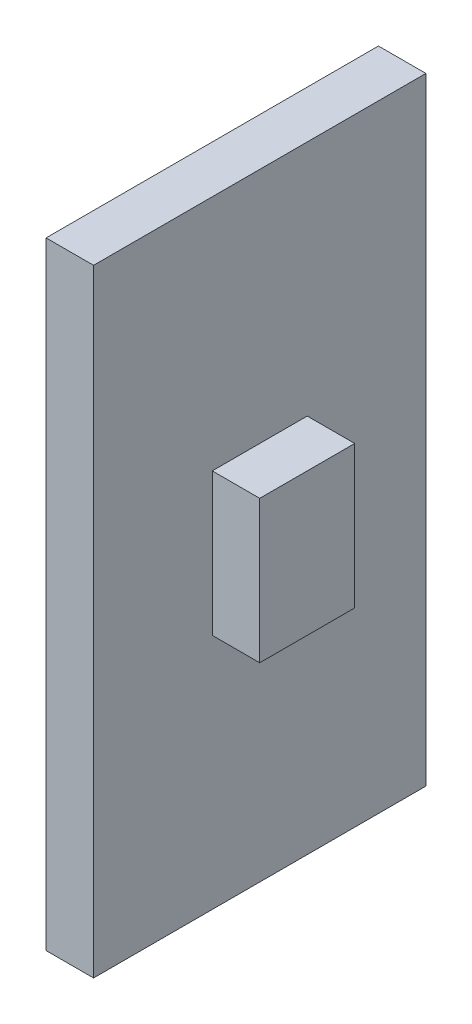
ISO-10303-21;
HEADER;
FILE_DESCRIPTION(('STEP AP214'),'2;1');
FILE_NAME('part.step','',(''),(''),'','','');
FILE_SCHEMA(('AUTOMOTIVE_DESIGN { 1 0 10303 214 1 1 1 1 }'));
ENDSEC;
DATA;
#1=APPLICATION_CONTEXT('core data for automotive mechanical design processes');
#2=APPLICATION_PROTOCOL_DEFINITION('international standard','automotive_design',2000,#1);
#3=PRODUCT_CONTEXT('',#1,'mechanical');
#4=PRODUCT('Part','Part','',(#3));
#5=PRODUCT_RELATED_PRODUCT_CATEGORY('part','',(#4));
#6=PRODUCT_DEFINITION_FORMATION('','',#4);
#7=PRODUCT_DEFINITION_CONTEXT('part definition',#1,'design');
#8=PRODUCT_DEFINITION('design','',#6,#7);
#9=PRODUCT_DEFINITION_SHAPE('','',#8);
#10=(LENGTH_UNIT() NAMED_UNIT(*) SI_UNIT(.MILLI.,.METRE.));
#11=(NAMED_UNIT(*) PLANE_ANGLE_UNIT() SI_UNIT($,.RADIAN.));
#12=(NAMED_UNIT(*) SI_UNIT($,.STERADIAN.) SOLID_ANGLE_UNIT());
#13=UNCERTAINTY_MEASURE_WITH_UNIT(LENGTH_MEASURE(1.E-05),#10,'distance_accuracy_value','');
#14=(GEOMETRIC_REPRESENTATION_CONTEXT(3) GLOBAL_UNCERTAINTY_ASSIGNED_CONTEXT((#13)) GLOBAL_UNIT_ASSIGNED_CONTEXT((#10,
#11,#12)) REPRESENTATION_CONTEXT('',''));
#15=CARTESIAN_POINT('',(0.,0.,0.));
#16=DIRECTION('',(0.,0.,1.));
#17=DIRECTION('',(1.,0.,0.));
#18=AXIS2_PLACEMENT_3D('',#15,#16,#17);
#19=CARTESIAN_POINT('',(2.,0.366666666666666,-1.));
#20=DIRECTION('',(0.,0.,1.));
#21=DIRECTION('',(0.,-1.,0.));
#22=AXIS2_PLACEMENT_3D('',#19,#20,#21);
#23=PLANE('',#22);
#24=DIRECTION('',(0.,1.,0.));
#25=VECTOR('',#24,1.);
#26=CARTESIAN_POINT('',(1.,0.366666666666666,-1.));
#27=LINE('',#26,#25);
#28=CARTESIAN_POINT('',(1.,-2.63333333333333,-1.));
#29=VERTEX_POINT('',#28);
#30=CARTESIAN_POINT('',(1.,0.366666666666666,-1.));
#31=VERTEX_POINT('',#30);
#32=EDGE_CURVE('E114',#29,#31,#27,.T.);
#33=ORIENTED_EDGE('',*,*,#32,.T.);
#34=DIRECTION('',(-1.,0.,0.));
#35=VECTOR('',#34,1.);
#36=CARTESIAN_POINT('',(2.,0.366666666666666,-1.));
#37=LINE('',#36,#35);
#38=CARTESIAN_POINT('',(2.,0.366666666666666,-1.));
#39=VERTEX_POINT('',#38);
#40=EDGE_CURVE('E12',#39,#31,#37,.T.);
#41=ORIENTED_EDGE('',*,*,#40,.F.);
#42=DIRECTION('',(0.,1.,0.));
#43=VECTOR('',#42,1.);
#44=CARTESIAN_POINT('',(2.,0.366666666666666,-1.));
#45=LINE('',#44,#43);
#46=CARTESIAN_POINT('',(2.,-2.63333333333333,-1.));
#47=VERTEX_POINT('',#46);
#48=EDGE_CURVE('E102',#47,#39,#45,.T.);
#49=ORIENTED_EDGE('',*,*,#48,.F.);
#50=DIRECTION('',(-1.,0.,0.));
#51=VECTOR('',#50,1.);
#52=CARTESIAN_POINT('',(2.,-2.63333333333333,-1.));
#53=LINE('',#52,#51);
#54=EDGE_CURVE('E110',#47,#29,#53,.T.);
#55=ORIENTED_EDGE('',*,*,#54,.T.);
#56=EDGE_LOOP('',(#33,#41,#49,#55));
#57=FACE_BOUND('',#56,.T.);
#58=ADVANCED_FACE('F51',(#57),#23,.F.);
#59=CARTESIAN_POINT('',(2.,0.366666666666666,0.999999999999999));
#60=DIRECTION('',(0.,-1.,0.));
#61=DIRECTION('',(0.,0.,-1.));
#62=AXIS2_PLACEMENT_3D('',#59,#60,#61);
#63=PLANE('',#62);
#64=DIRECTION('',(0.,0.,1.));
#65=VECTOR('',#64,1.);
#66=CARTESIAN_POINT('',(1.,0.366666666666666,0.999999999999999));
#67=LINE('',#66,#65);
#68=CARTESIAN_POINT('',(1.,0.366666666666666,0.999999999999999));
#69=VERTEX_POINT('',#68);
#70=EDGE_CURVE('E106',#31,#69,#67,.T.);
#71=ORIENTED_EDGE('',*,*,#70,.T.);
#72=DIRECTION('',(-1.,0.,0.));
#73=VECTOR('',#72,1.);
#74=CARTESIAN_POINT('',(2.,0.366666666666666,0.999999999999999));
#75=LINE('',#74,#73);
#76=CARTESIAN_POINT('',(2.,0.366666666666666,0.999999999999999));
#77=VERTEX_POINT('',#76);
#78=EDGE_CURVE('E59',#77,#69,#75,.T.);
#79=ORIENTED_EDGE('',*,*,#78,.F.);
#80=DIRECTION('',(0.,0.,1.));
#81=VECTOR('',#80,1.);
#82=CARTESIAN_POINT('',(2.,0.366666666666666,0.999999999999999));
#83=LINE('',#82,#81);
#84=EDGE_CURVE('E97',#39,#77,#83,.T.);
#85=ORIENTED_EDGE('',*,*,#84,.F.);
#86=ORIENTED_EDGE('',*,*,#40,.T.);
#87=EDGE_LOOP('',(#71,#79,#85,#86));
#88=FACE_BOUND('',#87,.T.);
#89=ADVANCED_FACE('F105',(#88),#63,.F.);
#90=CARTESIAN_POINT('',(2.,0.366666666666666,0.999999999999999));
#91=DIRECTION('',(0.,0.,-1.));
#92=DIRECTION('',(0.,1.,0.));
#93=AXIS2_PLACEMENT_3D('',#90,#91,#92);
#94=PLANE('',#93);
#95=DIRECTION('',(0.,-1.,0.));
#96=VECTOR('',#95,1.);
#97=CARTESIAN_POINT('',(1.,0.366666666666666,0.999999999999999));
#98=LINE('',#97,#96);
#99=CARTESIAN_POINT('',(1.,-2.63333333333333,0.999999999999999));
#100=VERTEX_POINT('',#99);
#101=EDGE_CURVE('E84',#69,#100,#98,.T.);
#102=ORIENTED_EDGE('',*,*,#101,.T.);
#103=DIRECTION('',(-1.,0.,0.));
#104=VECTOR('',#103,1.);
#105=CARTESIAN_POINT('',(2.,-2.63333333333333,0.999999999999999));
#106=LINE('',#105,#104);
#107=CARTESIAN_POINT('',(2.,-2.63333333333333,0.999999999999999));
#108=VERTEX_POINT('',#107);
#109=EDGE_CURVE('E107',#108,#100,#106,.T.);
#110=ORIENTED_EDGE('',*,*,#109,.F.);
#111=DIRECTION('',(0.,-1.,0.));
#112=VECTOR('',#111,1.);
#113=CARTESIAN_POINT('',(2.,0.366666666666666,0.999999999999999));
#114=LINE('',#113,#112);
#115=EDGE_CURVE('E100',#77,#108,#114,.T.);
#116=ORIENTED_EDGE('',*,*,#115,.F.);
#117=ORIENTED_EDGE('',*,*,#78,.T.);
#118=EDGE_LOOP('',(#102,#110,#116,#117));
#119=FACE_BOUND('',#118,.T.);
#120=ADVANCED_FACE('F108',(#119),#94,.F.);
#121=CARTESIAN_POINT('',(2.,-2.63333333333333,0.999999999999999));
#122=DIRECTION('',(0.,1.,0.));
#123=DIRECTION('',(0.,0.,1.));
#124=AXIS2_PLACEMENT_3D('',#121,#122,#123);
#125=PLANE('',#124);
#126=DIRECTION('',(0.,0.,-1.));
#127=VECTOR('',#126,1.);
#128=CARTESIAN_POINT('',(1.,-2.63333333333333,0.999999999999999));
#129=LINE('',#128,#127);
#130=EDGE_CURVE('E90',#100,#29,#129,.T.);
#131=ORIENTED_EDGE('',*,*,#130,.T.);
#132=ORIENTED_EDGE('',*,*,#54,.F.);
#133=DIRECTION('',(0.,0.,-1.));
#134=VECTOR('',#133,1.);
#135=CARTESIAN_POINT('',(2.,-2.63333333333333,0.999999999999999));
#136=LINE('',#135,#134);
#137=EDGE_CURVE('E67',#108,#47,#136,.T.);
#138=ORIENTED_EDGE('',*,*,#137,.F.);
#139=ORIENTED_EDGE('',*,*,#109,.T.);
#140=EDGE_LOOP('',(#131,#132,#138,#139));
#141=FACE_BOUND('',#140,.T.);
#142=ADVANCED_FACE('F121',(#141),#125,.F.);
#143=CARTESIAN_POINT('',(2.,0.,0.));
#144=DIRECTION('',(1.,0.,0.));
#145=DIRECTION('',(0.,0.,-1.));
#146=AXIS2_PLACEMENT_3D('',#143,#144,#145);
#147=PLANE('',#146);
#148=ORIENTED_EDGE('',*,*,#48,.T.);
#149=ORIENTED_EDGE('',*,*,#84,.T.);
#150=ORIENTED_EDGE('',*,*,#115,.T.);
#151=ORIENTED_EDGE('',*,*,#137,.T.);
#152=EDGE_LOOP('',(#148,#149,#150,#151));
#153=FACE_BOUND('',#152,.T.);
#154=ADVANCED_FACE('F98',(#153),#147,.T.);
#155=CARTESIAN_POINT('',(1.,0.,0.));
#156=DIRECTION('',(1.,0.,0.));
#157=DIRECTION('',(0.,0.,-1.));
#158=AXIS2_PLACEMENT_3D('',#155,#156,#157);
#159=PLANE('',#158);
#160=ORIENTED_EDGE('',*,*,#32,.F.);
#161=ORIENTED_EDGE('',*,*,#130,.F.);
#162=ORIENTED_EDGE('',*,*,#101,.F.);
#163=ORIENTED_EDGE('',*,*,#70,.F.);
#164=EDGE_LOOP('',(#160,#161,#162,#163));
#165=FACE_BOUND('',#164,.T.);
#166=ADVANCED_FACE('F124',(#165),#159,.F.);
#167=CLOSED_SHELL('',(#58,#89,#120,#142,#154,#166));
#168=MANIFOLD_SOLID_BREP('B2',#167);
#169=CARTESIAN_POINT('',(1.,-7.63333333333333,-3.5));
#170=DIRECTION('',(0.,0.,1.));
#171=DIRECTION('',(1.,0.,0.));
#172=AXIS2_PLACEMENT_3D('',#169,#170,#171);
#173=PLANE('',#172);
#174=DIRECTION('',(0.,1.,0.));
#175=VECTOR('',#174,1.);
#176=CARTESIAN_POINT('',(0.,-7.63333333333333,-3.5));
#177=LINE('',#176,#175);
#178=CARTESIAN_POINT('',(0.,-7.63333333333333,-3.5));
#179=VERTEX_POINT('',#178);
#180=CARTESIAN_POINT('',(0.,5.36666666666667,-3.5));
#181=VERTEX_POINT('',#180);
#182=EDGE_CURVE('E250',#179,#181,#177,.T.);
#183=ORIENTED_EDGE('',*,*,#182,.T.);
#184=DIRECTION('',(-1.,0.,0.));
#185=VECTOR('',#184,1.);
#186=CARTESIAN_POINT('',(1.,5.36666666666667,-3.5));
#187=LINE('',#186,#185);
#188=CARTESIAN_POINT('',(1.,5.36666666666667,-3.5));
#189=VERTEX_POINT('',#188);
#190=EDGE_CURVE('E49',#189,#181,#187,.T.);
#191=ORIENTED_EDGE('',*,*,#190,.F.);
#192=DIRECTION('',(0.,1.,0.));
#193=VECTOR('',#192,1.);
#194=CARTESIAN_POINT('',(1.,-7.63333333333333,-3.5));
#195=LINE('',#194,#193);
#196=CARTESIAN_POINT('',(1.,-7.63333333333333,-3.5));
#197=VERTEX_POINT('',#196);
#198=EDGE_CURVE('E238',#197,#189,#195,.T.);
#199=ORIENTED_EDGE('',*,*,#198,.F.);
#200=DIRECTION('',(-1.,0.,0.));
#201=VECTOR('',#200,1.);
#202=CARTESIAN_POINT('',(1.,-7.63333333333333,-3.5));
#203=LINE('',#202,#201);
#204=EDGE_CURVE('E246',#197,#179,#203,.T.);
#205=ORIENTED_EDGE('',*,*,#204,.T.);
#206=EDGE_LOOP('',(#183,#191,#199,#205));
#207=FACE_BOUND('',#206,.T.);
#208=ADVANCED_FACE('F187',(#207),#173,.F.);
#209=CARTESIAN_POINT('',(1.,5.36666666666667,3.5));
#210=DIRECTION('',(0.,-1.,0.));
#211=DIRECTION('',(0.,0.,-1.));
#212=AXIS2_PLACEMENT_3D('',#209,#210,#211);
#213=PLANE('',#212);
#214=DIRECTION('',(0.,0.,1.));
#215=VECTOR('',#214,1.);
#216=CARTESIAN_POINT('',(0.,5.36666666666667,3.5));
#217=LINE('',#216,#215);
#218=CARTESIAN_POINT('',(0.,5.36666666666667,3.5));
#219=VERTEX_POINT('',#218);
#220=EDGE_CURVE('E242',#181,#219,#217,.T.);
#221=ORIENTED_EDGE('',*,*,#220,.T.);
#222=DIRECTION('',(-1.,0.,0.));
#223=VECTOR('',#222,1.);
#224=CARTESIAN_POINT('',(1.,5.36666666666667,3.5));
#225=LINE('',#224,#223);
#226=CARTESIAN_POINT('',(1.,5.36666666666667,3.5));
#227=VERTEX_POINT('',#226);
#228=EDGE_CURVE('E195',#227,#219,#225,.T.);
#229=ORIENTED_EDGE('',*,*,#228,.F.);
#230=DIRECTION('',(0.,0.,1.));
#231=VECTOR('',#230,1.);
#232=CARTESIAN_POINT('',(1.,5.36666666666667,3.5));
#233=LINE('',#232,#231);
#234=EDGE_CURVE('E233',#189,#227,#233,.T.);
#235=ORIENTED_EDGE('',*,*,#234,.F.);
#236=ORIENTED_EDGE('',*,*,#190,.T.);
#237=EDGE_LOOP('',(#221,#229,#235,#236));
#238=FACE_BOUND('',#237,.T.);
#239=ADVANCED_FACE('F241',(#238),#213,.F.);
#240=CARTESIAN_POINT('',(1.,-7.63333333333333,3.5));
#241=DIRECTION('',(0.,0.,-1.));
#242=DIRECTION('',(-1.,0.,0.));
#243=AXIS2_PLACEMENT_3D('',#240,#241,#242);
#244=PLANE('',#243);
#245=DIRECTION('',(0.,-1.,0.));
#246=VECTOR('',#245,1.);
#247=CARTESIAN_POINT('',(0.,-7.63333333333333,3.5));
#248=LINE('',#247,#246);
#249=CARTESIAN_POINT('',(0.,-7.63333333333333,3.5));
#250=VERTEX_POINT('',#249);
#251=EDGE_CURVE('E220',#219,#250,#248,.T.);
#252=ORIENTED_EDGE('',*,*,#251,.T.);
#253=DIRECTION('',(-1.,0.,0.));
#254=VECTOR('',#253,1.);
#255=CARTESIAN_POINT('',(1.,-7.63333333333333,3.5));
#256=LINE('',#255,#254);
#257=CARTESIAN_POINT('',(1.,-7.63333333333333,3.5));
#258=VERTEX_POINT('',#257);
#259=EDGE_CURVE('E243',#258,#250,#256,.T.);
#260=ORIENTED_EDGE('',*,*,#259,.F.);
#261=DIRECTION('',(0.,-1.,0.));
#262=VECTOR('',#261,1.);
#263=CARTESIAN_POINT('',(1.,-7.63333333333333,3.5));
#264=LINE('',#263,#262);
#265=EDGE_CURVE('E236',#227,#258,#264,.T.);
#266=ORIENTED_EDGE('',*,*,#265,.F.);
#267=ORIENTED_EDGE('',*,*,#228,.T.);
#268=EDGE_LOOP('',(#252,#260,#266,#267));
#269=FACE_BOUND('',#268,.T.);
#270=ADVANCED_FACE('F244',(#269),#244,.F.);
#271=CARTESIAN_POINT('',(1.,-7.63333333333333,3.5));
#272=DIRECTION('',(0.,1.,0.));
#273=DIRECTION('',(0.,0.,1.));
#274=AXIS2_PLACEMENT_3D('',#271,#272,#273);
#275=PLANE('',#274);
#276=DIRECTION('',(0.,0.,-1.));
#277=VECTOR('',#276,1.);
#278=CARTESIAN_POINT('',(0.,-7.63333333333333,3.5));
#279=LINE('',#278,#277);
#280=EDGE_CURVE('E226',#250,#179,#279,.T.);
#281=ORIENTED_EDGE('',*,*,#280,.T.);
#282=ORIENTED_EDGE('',*,*,#204,.F.);
#283=DIRECTION('',(0.,0.,-1.));
#284=VECTOR('',#283,1.);
#285=CARTESIAN_POINT('',(1.,-7.63333333333333,3.5));
#286=LINE('',#285,#284);
#287=EDGE_CURVE('E203',#258,#197,#286,.T.);
#288=ORIENTED_EDGE('',*,*,#287,.F.);
#289=ORIENTED_EDGE('',*,*,#259,.T.);
#290=EDGE_LOOP('',(#281,#282,#288,#289));
#291=FACE_BOUND('',#290,.T.);
#292=ADVANCED_FACE('F257',(#291),#275,.F.);
#293=CARTESIAN_POINT('',(1.,0.,0.));
#294=DIRECTION('',(-1.,0.,0.));
#295=DIRECTION('',(0.,0.,1.));
#296=AXIS2_PLACEMENT_3D('',#293,#294,#295);
#297=PLANE('',#296);
#298=ORIENTED_EDGE('',*,*,#198,.T.);
#299=ORIENTED_EDGE('',*,*,#234,.T.);
#300=ORIENTED_EDGE('',*,*,#265,.T.);
#301=ORIENTED_EDGE('',*,*,#287,.T.);
#302=EDGE_LOOP('',(#298,#299,#300,#301));
#303=FACE_BOUND('',#302,.T.);
#304=ADVANCED_FACE('F234',(#303),#297,.F.);
#305=CARTESIAN_POINT('',(0.,0.,0.));
#306=DIRECTION('',(-1.,0.,0.));
#307=DIRECTION('',(0.,0.,1.));
#308=AXIS2_PLACEMENT_3D('',#305,#306,#307);
#309=PLANE('',#308);
#310=ORIENTED_EDGE('',*,*,#182,.F.);
#311=ORIENTED_EDGE('',*,*,#280,.F.);
#312=ORIENTED_EDGE('',*,*,#251,.F.);
#313=ORIENTED_EDGE('',*,*,#220,.F.);
#314=EDGE_LOOP('',(#310,#311,#312,#313));
#315=FACE_BOUND('',#314,.T.);
#316=ADVANCED_FACE('F260',(#315),#309,.T.);
#317=CLOSED_SHELL('',(#208,#239,#270,#292,#304,#316));
#318=MANIFOLD_SOLID_BREP('B6',#317);
#319=ADVANCED_BREP_SHAPE_REPRESENTATION('',(#18,#168,#318),#14);
#320=SHAPE_DEFINITION_REPRESENTATION(#9,#319);
ENDSEC;
END-ISO-10303-21;
